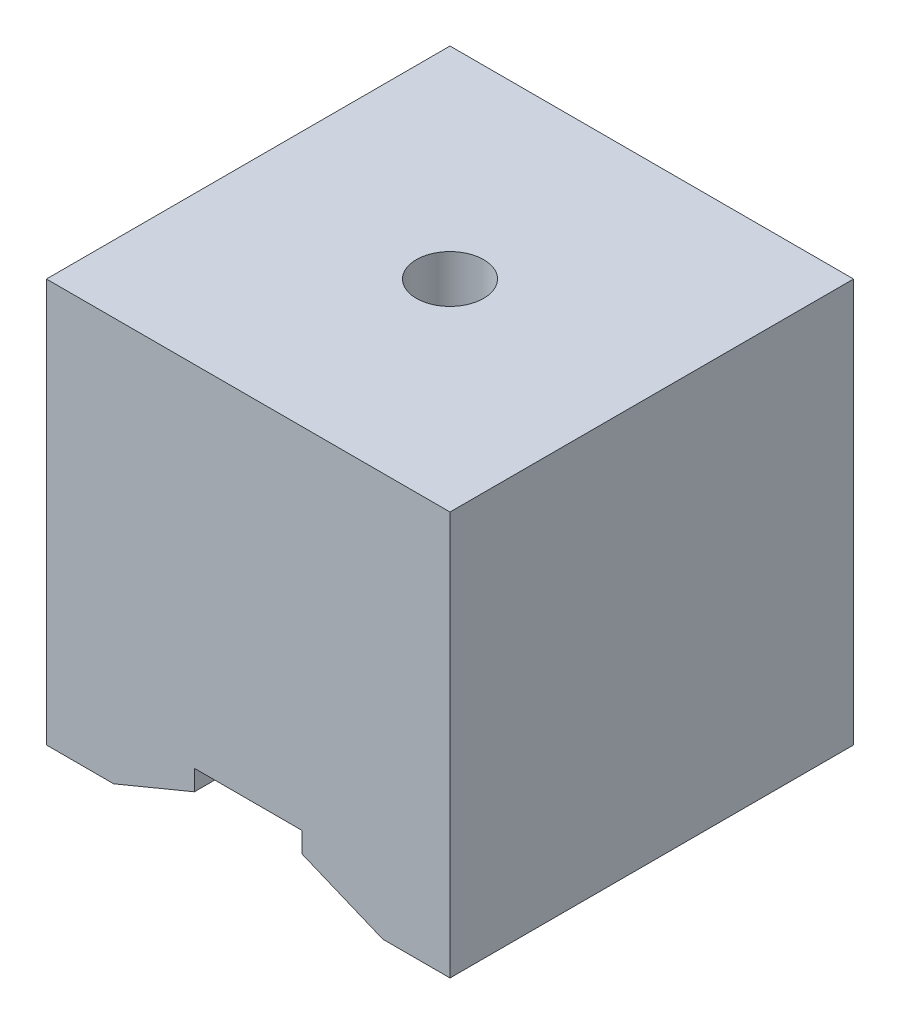
ISO-10303-21;
HEADER;
FILE_DESCRIPTION(('STEP AP214'),'2;1');
FILE_NAME('part.step','',(''),(''),'','','');
FILE_SCHEMA(('AUTOMOTIVE_DESIGN { 1 0 10303 214 1 1 1 1 }'));
ENDSEC;
DATA;
#1=APPLICATION_CONTEXT('core data for automotive mechanical design processes');
#2=APPLICATION_PROTOCOL_DEFINITION('international standard','automotive_design',2000,#1);
#3=PRODUCT_CONTEXT('',#1,'mechanical');
#4=PRODUCT('Part','Part','',(#3));
#5=PRODUCT_RELATED_PRODUCT_CATEGORY('part','',(#4));
#6=PRODUCT_DEFINITION_FORMATION('','',#4);
#7=PRODUCT_DEFINITION_CONTEXT('part definition',#1,'design');
#8=PRODUCT_DEFINITION('design','',#6,#7);
#9=PRODUCT_DEFINITION_SHAPE('','',#8);
#10=(LENGTH_UNIT() NAMED_UNIT(*) SI_UNIT(.MILLI.,.METRE.));
#11=(NAMED_UNIT(*) PLANE_ANGLE_UNIT() SI_UNIT($,.RADIAN.));
#12=(NAMED_UNIT(*) SI_UNIT($,.STERADIAN.) SOLID_ANGLE_UNIT());
#13=UNCERTAINTY_MEASURE_WITH_UNIT(LENGTH_MEASURE(1.E-05),#10,'distance_accuracy_value','');
#14=(GEOMETRIC_REPRESENTATION_CONTEXT(3) GLOBAL_UNCERTAINTY_ASSIGNED_CONTEXT((#13)) GLOBAL_UNIT_ASSIGNED_CONTEXT((#10,
#11,#12)) REPRESENTATION_CONTEXT('',''));
#15=CARTESIAN_POINT('',(0.,0.,0.));
#16=DIRECTION('',(0.,0.,1.));
#17=DIRECTION('',(1.,0.,0.));
#18=AXIS2_PLACEMENT_3D('',#15,#16,#17);
#19=CARTESIAN_POINT('',(0.,0.,30.));
#20=DIRECTION('',(0.,1.,0.));
#21=DIRECTION('',(0.,0.,1.));
#22=AXIS2_PLACEMENT_3D('',#19,#20,#21);
#23=PLANE('',#22);
#24=DIRECTION('',(1.,0.,0.));
#25=VECTOR('',#24,1.);
#26=CARTESIAN_POINT('',(0.,0.,0.));
#27=LINE('',#26,#25);
#28=CARTESIAN_POINT('',(0.,0.,0.));
#29=VERTEX_POINT('',#28);
#30=CARTESIAN_POINT('',(5.,0.,0.));
#31=VERTEX_POINT('',#30);
#32=EDGE_CURVE('E194',#29,#31,#27,.T.);
#33=ORIENTED_EDGE('',*,*,#32,.T.);
#34=DIRECTION('',(0.,0.,1.));
#35=VECTOR('',#34,1.);
#36=CARTESIAN_POINT('',(5.,0.,0.));
#37=LINE('',#36,#35);
#38=CARTESIAN_POINT('',(5.,0.,30.));
#39=VERTEX_POINT('',#38);
#40=EDGE_CURVE('E171',#31,#39,#37,.T.);
#41=ORIENTED_EDGE('',*,*,#40,.T.);
#42=DIRECTION('',(1.,0.,0.));
#43=VECTOR('',#42,1.);
#44=CARTESIAN_POINT('',(0.,0.,30.));
#45=LINE('',#44,#43);
#46=CARTESIAN_POINT('',(0.,0.,30.));
#47=VERTEX_POINT('',#46);
#48=EDGE_CURVE('E92',#47,#39,#45,.T.);
#49=ORIENTED_EDGE('',*,*,#48,.F.);
#50=DIRECTION('',(0.,0.,-1.));
#51=VECTOR('',#50,1.);
#52=CARTESIAN_POINT('',(0.,0.,30.));
#53=LINE('',#52,#51);
#54=EDGE_CURVE('E11',#47,#29,#53,.T.);
#55=ORIENTED_EDGE('',*,*,#54,.T.);
#56=EDGE_LOOP('',(#33,#41,#49,#55));
#57=FACE_BOUND('',#56,.T.);
#58=ADVANCED_FACE('F40',(#57),#23,.F.);
#59=CARTESIAN_POINT('',(0.,0.,30.));
#60=DIRECTION('',(1.,0.,0.));
#61=DIRECTION('',(0.,0.,-1.));
#62=AXIS2_PLACEMENT_3D('',#59,#60,#61);
#63=PLANE('',#62);
#64=DIRECTION('',(0.,-1.,0.));
#65=VECTOR('',#64,1.);
#66=CARTESIAN_POINT('',(0.,0.,0.));
#67=LINE('',#66,#65);
#68=CARTESIAN_POINT('',(0.,30.,0.));
#69=VERTEX_POINT('',#68);
#70=EDGE_CURVE('E173',#69,#29,#67,.T.);
#71=ORIENTED_EDGE('',*,*,#70,.T.);
#72=ORIENTED_EDGE('',*,*,#54,.F.);
#73=DIRECTION('',(0.,-1.,0.));
#74=VECTOR('',#73,1.);
#75=CARTESIAN_POINT('',(0.,0.,30.));
#76=LINE('',#75,#74);
#77=CARTESIAN_POINT('',(0.,30.,30.));
#78=VERTEX_POINT('',#77);
#79=EDGE_CURVE('E183',#78,#47,#76,.T.);
#80=ORIENTED_EDGE('',*,*,#79,.F.);
#81=DIRECTION('',(0.,0.,-1.));
#82=VECTOR('',#81,1.);
#83=CARTESIAN_POINT('',(0.,30.,30.));
#84=LINE('',#83,#82);
#85=EDGE_CURVE('E190',#78,#69,#84,.T.);
#86=ORIENTED_EDGE('',*,*,#85,.T.);
#87=EDGE_LOOP('',(#71,#72,#80,#86));
#88=FACE_BOUND('',#87,.T.);
#89=ADVANCED_FACE('F42',(#88),#63,.F.);
#90=CARTESIAN_POINT('',(25.,0.,30.));
#91=VERTEX_POINT('',#90);
#92=CARTESIAN_POINT('',(30.,0.,30.));
#93=VERTEX_POINT('',#92);
#94=EDGE_CURVE('E185',#91,#93,#45,.T.);
#95=ORIENTED_EDGE('',*,*,#94,.F.);
#96=DIRECTION('',(0.,0.,1.));
#97=VECTOR('',#96,1.);
#98=CARTESIAN_POINT('',(25.,0.,0.));
#99=LINE('',#98,#97);
#100=CARTESIAN_POINT('',(25.,0.,0.));
#101=VERTEX_POINT('',#100);
#102=EDGE_CURVE('E160',#101,#91,#99,.T.);
#103=ORIENTED_EDGE('',*,*,#102,.F.);
#104=CARTESIAN_POINT('',(30.,0.,0.));
#105=VERTEX_POINT('',#104);
#106=EDGE_CURVE('E193',#101,#105,#27,.T.);
#107=ORIENTED_EDGE('',*,*,#106,.T.);
#108=DIRECTION('',(0.,0.,-1.));
#109=VECTOR('',#108,1.);
#110=CARTESIAN_POINT('',(30.,0.,30.));
#111=LINE('',#110,#109);
#112=EDGE_CURVE('E48',#93,#105,#111,.T.);
#113=ORIENTED_EDGE('',*,*,#112,.F.);
#114=EDGE_LOOP('',(#95,#103,#107,#113));
#115=FACE_BOUND('',#114,.T.);
#116=ADVANCED_FACE('F228',(#115),#23,.F.);
#117=CARTESIAN_POINT('',(30.,0.,30.));
#118=DIRECTION('',(-1.,0.,0.));
#119=DIRECTION('',(0.,0.,1.));
#120=AXIS2_PLACEMENT_3D('',#117,#118,#119);
#121=PLANE('',#120);
#122=DIRECTION('',(0.,1.,0.));
#123=VECTOR('',#122,1.);
#124=CARTESIAN_POINT('',(30.,0.,0.));
#125=LINE('',#124,#123);
#126=CARTESIAN_POINT('',(30.,30.,0.));
#127=VERTEX_POINT('',#126);
#128=EDGE_CURVE('E197',#105,#127,#125,.T.);
#129=ORIENTED_EDGE('',*,*,#128,.T.);
#130=DIRECTION('',(0.,0.,-1.));
#131=VECTOR('',#130,1.);
#132=CARTESIAN_POINT('',(30.,30.,30.));
#133=LINE('',#132,#131);
#134=CARTESIAN_POINT('',(30.,30.,30.));
#135=VERTEX_POINT('',#134);
#136=EDGE_CURVE('E201',#135,#127,#133,.T.);
#137=ORIENTED_EDGE('',*,*,#136,.F.);
#138=DIRECTION('',(0.,1.,0.));
#139=VECTOR('',#138,1.);
#140=CARTESIAN_POINT('',(30.,0.,30.));
#141=LINE('',#140,#139);
#142=EDGE_CURVE('E187',#93,#135,#141,.T.);
#143=ORIENTED_EDGE('',*,*,#142,.F.);
#144=ORIENTED_EDGE('',*,*,#112,.T.);
#145=EDGE_LOOP('',(#129,#137,#143,#144));
#146=FACE_BOUND('',#145,.T.);
#147=ADVANCED_FACE('F207',(#146),#121,.F.);
#148=CARTESIAN_POINT('',(0.,30.,30.));
#149=DIRECTION('',(0.,-1.,0.));
#150=DIRECTION('',(0.,0.,-1.));
#151=AXIS2_PLACEMENT_3D('',#148,#149,#150);
#152=PLANE('',#151);
#153=CARTESIAN_POINT('',(15.,30.,15.));
#154=DIRECTION('',(0.,1.,0.));
#155=DIRECTION('',(0.,0.,1.));
#156=AXIS2_PLACEMENT_3D('',#153,#154,#155);
#157=CIRCLE('',#156,2.5);
#158=CARTESIAN_POINT('',(15.,30.,17.5));
#159=VERTEX_POINT('',#158);
#160=EDGE_CURVE('E139',#159,#159,#157,.T.);
#161=ORIENTED_EDGE('',*,*,#160,.F.);
#162=EDGE_LOOP('',(#161));
#163=FACE_BOUND('',#162,.T.);
#164=DIRECTION('',(-1.,0.,0.));
#165=VECTOR('',#164,1.);
#166=CARTESIAN_POINT('',(0.,30.,0.));
#167=LINE('',#166,#165);
#168=EDGE_CURVE('E85',#127,#69,#167,.T.);
#169=ORIENTED_EDGE('',*,*,#168,.T.);
#170=ORIENTED_EDGE('',*,*,#85,.F.);
#171=DIRECTION('',(-1.,0.,0.));
#172=VECTOR('',#171,1.);
#173=CARTESIAN_POINT('',(0.,30.,30.));
#174=LINE('',#173,#172);
#175=EDGE_CURVE('E64',#135,#78,#174,.T.);
#176=ORIENTED_EDGE('',*,*,#175,.F.);
#177=ORIENTED_EDGE('',*,*,#136,.T.);
#178=EDGE_LOOP('',(#169,#170,#176,#177));
#179=FACE_BOUND('',#178,.T.);
#180=ADVANCED_FACE('F218',(#163,#179),#152,.F.);
#181=CARTESIAN_POINT('',(0.,0.,30.));
#182=DIRECTION('',(0.,0.,-1.));
#183=DIRECTION('',(-1.,0.,0.));
#184=AXIS2_PLACEMENT_3D('',#181,#182,#183);
#185=PLANE('',#184);
#186=ORIENTED_EDGE('',*,*,#48,.T.);
#187=DIRECTION('',(-0.923879532511286,-0.38268343236509,0.));
#188=VECTOR('',#187,1.);
#189=CARTESIAN_POINT('',(5.,0.,30.));
#190=LINE('',#189,#188);
#191=CARTESIAN_POINT('',(11.,2.48528137423858,30.));
#192=VERTEX_POINT('',#191);
#193=EDGE_CURVE('E150',#192,#39,#190,.T.);
#194=ORIENTED_EDGE('',*,*,#193,.F.);
#195=DIRECTION('',(0.,-1.,0.));
#196=VECTOR('',#195,1.);
#197=CARTESIAN_POINT('',(11.,2.48528137423858,30.));
#198=LINE('',#197,#196);
#199=CARTESIAN_POINT('',(11.,4.,30.));
#200=VERTEX_POINT('',#199);
#201=EDGE_CURVE('E167',#200,#192,#198,.T.);
#202=ORIENTED_EDGE('',*,*,#201,.F.);
#203=DIRECTION('',(-1.,0.,0.));
#204=VECTOR('',#203,1.);
#205=CARTESIAN_POINT('',(11.,4.,30.));
#206=LINE('',#205,#204);
#207=CARTESIAN_POINT('',(19.,4.,30.));
#208=VERTEX_POINT('',#207);
#209=EDGE_CURVE('E164',#208,#200,#206,.T.);
#210=ORIENTED_EDGE('',*,*,#209,.F.);
#211=DIRECTION('',(0.,1.,0.));
#212=VECTOR('',#211,1.);
#213=CARTESIAN_POINT('',(19.,4.,30.));
#214=LINE('',#213,#212);
#215=CARTESIAN_POINT('',(19.,2.48528137423858,30.));
#216=VERTEX_POINT('',#215);
#217=EDGE_CURVE('E142',#216,#208,#214,.T.);
#218=ORIENTED_EDGE('',*,*,#217,.F.);
#219=DIRECTION('',(-0.923879532511287,0.38268343236509,0.));
#220=VECTOR('',#219,1.);
#221=CARTESIAN_POINT('',(19.,2.48528137423858,30.));
#222=LINE('',#221,#220);
#223=EDGE_CURVE('E138',#91,#216,#222,.T.);
#224=ORIENTED_EDGE('',*,*,#223,.F.);
#225=ORIENTED_EDGE('',*,*,#94,.T.);
#226=ORIENTED_EDGE('',*,*,#142,.T.);
#227=ORIENTED_EDGE('',*,*,#175,.T.);
#228=ORIENTED_EDGE('',*,*,#79,.T.);
#229=EDGE_LOOP('',(#186,#194,#202,#210,#218,#224,#225,#226,#227,#228));
#230=FACE_BOUND('',#229,.T.);
#231=ADVANCED_FACE('F220',(#230),#185,.F.);
#232=CARTESIAN_POINT('',(0.,0.,0.));
#233=DIRECTION('',(0.,0.,-1.));
#234=DIRECTION('',(-1.,0.,0.));
#235=AXIS2_PLACEMENT_3D('',#232,#233,#234);
#236=PLANE('',#235);
#237=DIRECTION('',(-0.923879532511286,-0.38268343236509,0.));
#238=VECTOR('',#237,1.);
#239=CARTESIAN_POINT('',(5.,0.,0.));
#240=LINE('',#239,#238);
#241=CARTESIAN_POINT('',(11.,2.48528137423858,0.));
#242=VERTEX_POINT('',#241);
#243=EDGE_CURVE('E158',#242,#31,#240,.T.);
#244=ORIENTED_EDGE('',*,*,#243,.T.);
#245=ORIENTED_EDGE('',*,*,#32,.F.);
#246=ORIENTED_EDGE('',*,*,#70,.F.);
#247=ORIENTED_EDGE('',*,*,#168,.F.);
#248=ORIENTED_EDGE('',*,*,#128,.F.);
#249=ORIENTED_EDGE('',*,*,#106,.F.);
#250=DIRECTION('',(-0.923879532511287,0.38268343236509,0.));
#251=VECTOR('',#250,1.);
#252=CARTESIAN_POINT('',(19.,2.48528137423858,0.));
#253=LINE('',#252,#251);
#254=CARTESIAN_POINT('',(19.,2.48528137423858,0.));
#255=VERTEX_POINT('',#254);
#256=EDGE_CURVE('E147',#101,#255,#253,.T.);
#257=ORIENTED_EDGE('',*,*,#256,.T.);
#258=DIRECTION('',(0.,1.,0.));
#259=VECTOR('',#258,1.);
#260=CARTESIAN_POINT('',(19.,4.,0.));
#261=LINE('',#260,#259);
#262=CARTESIAN_POINT('',(19.,4.,0.));
#263=VERTEX_POINT('',#262);
#264=EDGE_CURVE('E55',#255,#263,#261,.T.);
#265=ORIENTED_EDGE('',*,*,#264,.T.);
#266=DIRECTION('',(-1.,0.,0.));
#267=VECTOR('',#266,1.);
#268=CARTESIAN_POINT('',(11.,4.,0.));
#269=LINE('',#268,#267);
#270=CARTESIAN_POINT('',(11.,4.,0.));
#271=VERTEX_POINT('',#270);
#272=EDGE_CURVE('E152',#263,#271,#269,.T.);
#273=ORIENTED_EDGE('',*,*,#272,.T.);
#274=DIRECTION('',(0.,-1.,0.));
#275=VECTOR('',#274,1.);
#276=CARTESIAN_POINT('',(11.,2.48528137423858,0.));
#277=LINE('',#276,#275);
#278=EDGE_CURVE('E155',#271,#242,#277,.T.);
#279=ORIENTED_EDGE('',*,*,#278,.T.);
#280=EDGE_LOOP('',(#244,#245,#246,#247,#248,#249,#257,#265,#273,#279));
#281=FACE_BOUND('',#280,.T.);
#282=ADVANCED_FACE('F213',(#281),#236,.T.);
#283=CARTESIAN_POINT('',(5.,0.,0.));
#284=DIRECTION('',(-0.38268343236509,0.923879532511286,0.));
#285=DIRECTION('',(-0.923879532511287,-0.382683432365091,0.));
#286=AXIS2_PLACEMENT_3D('',#283,#284,#285);
#287=PLANE('',#286);
#288=ORIENTED_EDGE('',*,*,#193,.T.);
#289=ORIENTED_EDGE('',*,*,#40,.F.);
#290=ORIENTED_EDGE('',*,*,#243,.F.);
#291=DIRECTION('',(0.,0.,1.));
#292=VECTOR('',#291,1.);
#293=CARTESIAN_POINT('',(11.,2.48528137423858,0.));
#294=LINE('',#293,#292);
#295=EDGE_CURVE('E174',#242,#192,#294,.T.);
#296=ORIENTED_EDGE('',*,*,#295,.T.);
#297=EDGE_LOOP('',(#288,#289,#290,#296));
#298=FACE_BOUND('',#297,.T.);
#299=ADVANCED_FACE('F254',(#298),#287,.F.);
#300=CARTESIAN_POINT('',(11.,2.48528137423858,0.));
#301=DIRECTION('',(-1.,0.,0.));
#302=DIRECTION('',(0.,0.,1.));
#303=AXIS2_PLACEMENT_3D('',#300,#301,#302);
#304=PLANE('',#303);
#305=ORIENTED_EDGE('',*,*,#201,.T.);
#306=ORIENTED_EDGE('',*,*,#295,.F.);
#307=ORIENTED_EDGE('',*,*,#278,.F.);
#308=DIRECTION('',(0.,0.,1.));
#309=VECTOR('',#308,1.);
#310=CARTESIAN_POINT('',(11.,4.,0.));
#311=LINE('',#310,#309);
#312=EDGE_CURVE('E176',#271,#200,#311,.T.);
#313=ORIENTED_EDGE('',*,*,#312,.T.);
#314=EDGE_LOOP('',(#305,#306,#307,#313));
#315=FACE_BOUND('',#314,.T.);
#316=ADVANCED_FACE('F250',(#315),#304,.F.);
#317=CARTESIAN_POINT('',(11.,4.,0.));
#318=DIRECTION('',(0.,1.,0.));
#319=DIRECTION('',(-1.,0.,0.));
#320=AXIS2_PLACEMENT_3D('',#317,#318,#319);
#321=PLANE('',#320);
#322=ORIENTED_EDGE('',*,*,#209,.T.);
#323=ORIENTED_EDGE('',*,*,#312,.F.);
#324=ORIENTED_EDGE('',*,*,#272,.F.);
#325=DIRECTION('',(0.,0.,1.));
#326=VECTOR('',#325,1.);
#327=CARTESIAN_POINT('',(19.,4.,0.));
#328=LINE('',#327,#326);
#329=EDGE_CURVE('E178',#263,#208,#328,.T.);
#330=ORIENTED_EDGE('',*,*,#329,.T.);
#331=EDGE_LOOP('',(#322,#323,#324,#330));
#332=FACE_BOUND('',#331,.T.);
#333=ADVANCED_FACE('F247',(#332),#321,.F.);
#334=CARTESIAN_POINT('',(19.,4.,0.));
#335=DIRECTION('',(1.,0.,0.));
#336=DIRECTION('',(0.,0.,-1.));
#337=AXIS2_PLACEMENT_3D('',#334,#335,#336);
#338=PLANE('',#337);
#339=ORIENTED_EDGE('',*,*,#217,.T.);
#340=ORIENTED_EDGE('',*,*,#329,.F.);
#341=ORIENTED_EDGE('',*,*,#264,.F.);
#342=DIRECTION('',(0.,0.,1.));
#343=VECTOR('',#342,1.);
#344=CARTESIAN_POINT('',(19.,2.48528137423858,0.));
#345=LINE('',#344,#343);
#346=EDGE_CURVE('E180',#255,#216,#345,.T.);
#347=ORIENTED_EDGE('',*,*,#346,.T.);
#348=EDGE_LOOP('',(#339,#340,#341,#347));
#349=FACE_BOUND('',#348,.T.);
#350=ADVANCED_FACE('F266',(#349),#338,.F.);
#351=CARTESIAN_POINT('',(19.,2.48528137423858,0.));
#352=DIRECTION('',(0.38268343236509,0.923879532511287,0.));
#353=DIRECTION('',(-0.923879532511287,0.38268343236509,0.));
#354=AXIS2_PLACEMENT_3D('',#351,#352,#353);
#355=PLANE('',#354);
#356=ORIENTED_EDGE('',*,*,#223,.T.);
#357=ORIENTED_EDGE('',*,*,#346,.F.);
#358=ORIENTED_EDGE('',*,*,#256,.F.);
#359=ORIENTED_EDGE('',*,*,#102,.T.);
#360=EDGE_LOOP('',(#356,#357,#358,#359));
#361=FACE_BOUND('',#360,.T.);
#362=ADVANCED_FACE('F132',(#361),#355,.F.);
#363=CARTESIAN_POINT('',(15.,15.,15.));
#364=DIRECTION('',(0.,1.,0.));
#365=DIRECTION('',(0.,0.,1.));
#366=AXIS2_PLACEMENT_3D('',#363,#364,#365);
#367=CONICAL_SURFACE('',#366,2.5,1.02974425867665);
#368=CARTESIAN_POINT('',(15.,13.4978484524311,15.));
#369=VERTEX_POINT('',#368);
#370=VERTEX_LOOP('',#369);
#371=FACE_BOUND('',#370,.T.);
#372=CARTESIAN_POINT('',(15.,15.,15.));
#373=DIRECTION('',(0.,1.,0.));
#374=DIRECTION('',(0.,0.,1.));
#375=AXIS2_PLACEMENT_3D('',#372,#373,#374);
#376=CIRCLE('',#375,2.5);
#377=CARTESIAN_POINT('',(15.,15.,17.5));
#378=VERTEX_POINT('',#377);
#379=EDGE_CURVE('E136',#378,#378,#376,.T.);
#380=ORIENTED_EDGE('',*,*,#379,.T.);
#381=EDGE_LOOP('',(#380));
#382=FACE_BOUND('',#381,.T.);
#383=ADVANCED_FACE('F128',(#371,#382),#367,.F.);
#384=CARTESIAN_POINT('',(15.,30.,15.));
#385=DIRECTION('',(0.,1.,0.));
#386=DIRECTION('',(0.,0.,1.));
#387=AXIS2_PLACEMENT_3D('',#384,#385,#386);
#388=CYLINDRICAL_SURFACE('',#387,2.5);
#389=ORIENTED_EDGE('',*,*,#379,.F.);
#390=EDGE_LOOP('',(#389));
#391=FACE_BOUND('',#390,.T.);
#392=ORIENTED_EDGE('',*,*,#160,.T.);
#393=EDGE_LOOP('',(#392));
#394=FACE_BOUND('',#393,.T.);
#395=ADVANCED_FACE('F131',(#391,#394),#388,.F.);
#396=CLOSED_SHELL('',(#58,#89,#116,#147,#180,#231,#282,#299,#316,#333,#350,#362,#383,#395));
#397=MANIFOLD_SOLID_BREP('B2',#396);
#398=ADVANCED_BREP_SHAPE_REPRESENTATION('',(#18,#397),#14);
#399=SHAPE_DEFINITION_REPRESENTATION(#9,#398);
ENDSEC;
END-ISO-10303-21;
